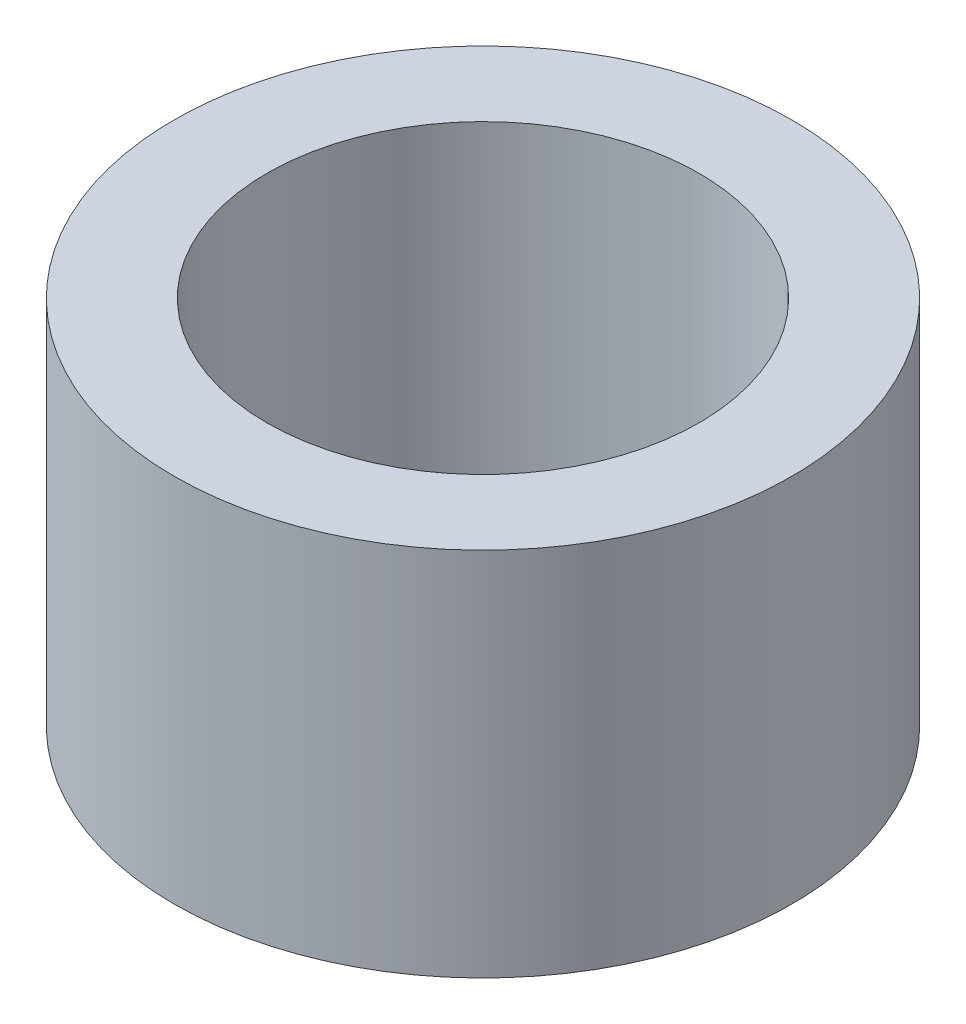
ISO-10303-21;
HEADER;
FILE_DESCRIPTION(('STEP AP214'),'2;1');
FILE_NAME('part.step','',(''),(''),'','','');
FILE_SCHEMA(('AUTOMOTIVE_DESIGN { 1 0 10303 214 1 1 1 1 }'));
ENDSEC;
DATA;
#1=APPLICATION_CONTEXT('core data for automotive mechanical design processes');
#2=APPLICATION_PROTOCOL_DEFINITION('international standard','automotive_design',2000,#1);
#3=PRODUCT_CONTEXT('',#1,'mechanical');
#4=PRODUCT('Part','Part','',(#3));
#5=PRODUCT_RELATED_PRODUCT_CATEGORY('part','',(#4));
#6=PRODUCT_DEFINITION_FORMATION('','',#4);
#7=PRODUCT_DEFINITION_CONTEXT('part definition',#1,'design');
#8=PRODUCT_DEFINITION('design','',#6,#7);
#9=PRODUCT_DEFINITION_SHAPE('','',#8);
#10=(LENGTH_UNIT() NAMED_UNIT(*) SI_UNIT(.MILLI.,.METRE.));
#11=(NAMED_UNIT(*) PLANE_ANGLE_UNIT() SI_UNIT($,.RADIAN.));
#12=(NAMED_UNIT(*) SI_UNIT($,.STERADIAN.) SOLID_ANGLE_UNIT());
#13=UNCERTAINTY_MEASURE_WITH_UNIT(LENGTH_MEASURE(1.E-05),#10,'distance_accuracy_value','');
#14=(GEOMETRIC_REPRESENTATION_CONTEXT(3) GLOBAL_UNCERTAINTY_ASSIGNED_CONTEXT((#13)) GLOBAL_UNIT_ASSIGNED_CONTEXT((#10,
#11,#12)) REPRESENTATION_CONTEXT('',''));
#15=CARTESIAN_POINT('',(0.,0.,0.));
#16=DIRECTION('',(0.,0.,1.));
#17=DIRECTION('',(1.,0.,0.));
#18=AXIS2_PLACEMENT_3D('',#15,#16,#17);
#19=CARTESIAN_POINT('',(0.,3.,0.));
#20=DIRECTION('',(0.,1.,0.));
#21=DIRECTION('',(0.,0.,1.));
#22=AXIS2_PLACEMENT_3D('',#19,#20,#21);
#23=PLANE('',#22);
#24=CARTESIAN_POINT('',(0.,3.,0.));
#25=DIRECTION('',(0.,1.,0.));
#26=DIRECTION('',(0.,0.,1.));
#27=AXIS2_PLACEMENT_3D('',#24,#25,#26);
#28=CIRCLE('',#27,2.5);
#29=CARTESIAN_POINT('',(0.,3.,2.5));
#30=VERTEX_POINT('',#29);
#31=EDGE_CURVE('E10',#30,#30,#28,.T.);
#32=ORIENTED_EDGE('',*,*,#31,.T.);
#33=EDGE_LOOP('',(#32));
#34=FACE_BOUND('',#33,.T.);
#35=CARTESIAN_POINT('',(0.,3.,0.));
#36=DIRECTION('',(0.,1.,0.));
#37=DIRECTION('',(0.,0.,1.));
#38=AXIS2_PLACEMENT_3D('',#35,#36,#37);
#39=CIRCLE('',#38,1.75);
#40=CARTESIAN_POINT('',(0.,3.,1.75));
#41=VERTEX_POINT('',#40);
#42=EDGE_CURVE('E41',#41,#41,#39,.T.);
#43=ORIENTED_EDGE('',*,*,#42,.F.);
#44=EDGE_LOOP('',(#43));
#45=FACE_BOUND('',#44,.T.);
#46=ADVANCED_FACE('F30',(#34,#45),#23,.T.);
#47=CARTESIAN_POINT('',(0.,0.,0.));
#48=DIRECTION('',(0.,1.,0.));
#49=DIRECTION('',(0.,0.,1.));
#50=AXIS2_PLACEMENT_3D('',#47,#48,#49);
#51=PLANE('',#50);
#52=CARTESIAN_POINT('',(0.,0.,0.));
#53=DIRECTION('',(0.,1.,0.));
#54=DIRECTION('',(0.,0.,1.));
#55=AXIS2_PLACEMENT_3D('',#52,#53,#54);
#56=CIRCLE('',#55,2.5);
#57=CARTESIAN_POINT('',(0.,0.,2.5));
#58=VERTEX_POINT('',#57);
#59=EDGE_CURVE('E34',#58,#58,#56,.T.);
#60=ORIENTED_EDGE('',*,*,#59,.F.);
#61=EDGE_LOOP('',(#60));
#62=FACE_BOUND('',#61,.T.);
#63=CARTESIAN_POINT('',(0.,0.,0.));
#64=DIRECTION('',(0.,1.,0.));
#65=DIRECTION('',(0.,0.,1.));
#66=AXIS2_PLACEMENT_3D('',#63,#64,#65);
#67=CIRCLE('',#66,1.75);
#68=CARTESIAN_POINT('',(0.,0.,1.75));
#69=VERTEX_POINT('',#68);
#70=EDGE_CURVE('E43',#69,#69,#67,.T.);
#71=ORIENTED_EDGE('',*,*,#70,.T.);
#72=EDGE_LOOP('',(#71));
#73=FACE_BOUND('',#72,.T.);
#74=ADVANCED_FACE('F53',(#62,#73),#51,.F.);
#75=CARTESIAN_POINT('',(0.,3.,0.));
#76=DIRECTION('',(0.,-1.,0.));
#77=DIRECTION('',(0.,0.,-1.));
#78=AXIS2_PLACEMENT_3D('',#75,#76,#77);
#79=CYLINDRICAL_SURFACE('',#78,2.5);
#80=ORIENTED_EDGE('',*,*,#31,.F.);
#81=EDGE_LOOP('',(#80));
#82=FACE_BOUND('',#81,.T.);
#83=ORIENTED_EDGE('',*,*,#59,.T.);
#84=EDGE_LOOP('',(#83));
#85=FACE_BOUND('',#84,.T.);
#86=ADVANCED_FACE('F32',(#82,#85),#79,.T.);
#87=CARTESIAN_POINT('',(0.,3.,0.));
#88=DIRECTION('',(0.,-1.,0.));
#89=DIRECTION('',(0.,0.,-1.));
#90=AXIS2_PLACEMENT_3D('',#87,#88,#89);
#91=CYLINDRICAL_SURFACE('',#90,1.75);
#92=ORIENTED_EDGE('',*,*,#42,.T.);
#93=EDGE_LOOP('',(#92));
#94=FACE_BOUND('',#93,.T.);
#95=ORIENTED_EDGE('',*,*,#70,.F.);
#96=EDGE_LOOP('',(#95));
#97=FACE_BOUND('',#96,.T.);
#98=ADVANCED_FACE('F49',(#94,#97),#91,.F.);
#99=CLOSED_SHELL('',(#46,#74,#86,#98));
#100=MANIFOLD_SOLID_BREP('B2',#99);
#101=ADVANCED_BREP_SHAPE_REPRESENTATION('',(#18,#100),#14);
#102=SHAPE_DEFINITION_REPRESENTATION(#9,#101);
ENDSEC;
END-ISO-10303-21;
